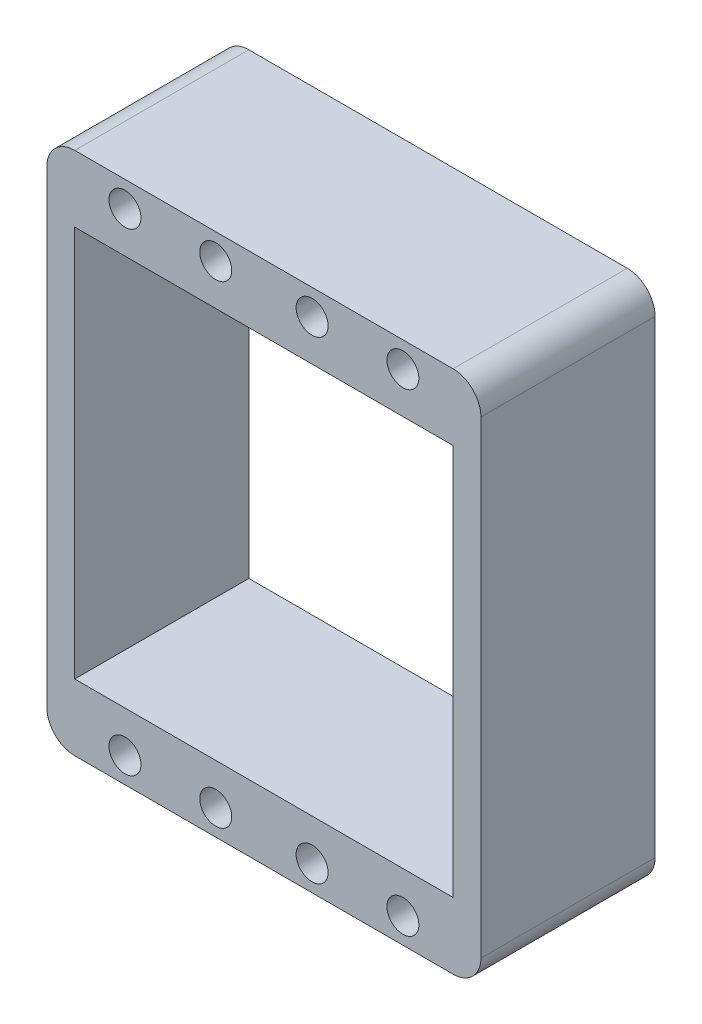
ISO-10303-21;
HEADER;
FILE_DESCRIPTION(('STEP AP214'),'2;1');
FILE_NAME('part.step','',(''),(''),'','','');
FILE_SCHEMA(('AUTOMOTIVE_DESIGN { 1 0 10303 214 1 1 1 1 }'));
ENDSEC;
DATA;
#1=APPLICATION_CONTEXT('core data for automotive mechanical design processes');
#2=APPLICATION_PROTOCOL_DEFINITION('international standard','automotive_design',2000,#1);
#3=PRODUCT_CONTEXT('',#1,'mechanical');
#4=PRODUCT('Part','Part','',(#3));
#5=PRODUCT_RELATED_PRODUCT_CATEGORY('part','',(#4));
#6=PRODUCT_DEFINITION_FORMATION('','',#4);
#7=PRODUCT_DEFINITION_CONTEXT('part definition',#1,'design');
#8=PRODUCT_DEFINITION('design','',#6,#7);
#9=PRODUCT_DEFINITION_SHAPE('','',#8);
#10=(LENGTH_UNIT() NAMED_UNIT(*) SI_UNIT(.MILLI.,.METRE.));
#11=(NAMED_UNIT(*) PLANE_ANGLE_UNIT() SI_UNIT($,.RADIAN.));
#12=(NAMED_UNIT(*) SI_UNIT($,.STERADIAN.) SOLID_ANGLE_UNIT());
#13=UNCERTAINTY_MEASURE_WITH_UNIT(LENGTH_MEASURE(1.E-05),#10,'distance_accuracy_value','');
#14=(GEOMETRIC_REPRESENTATION_CONTEXT(3) GLOBAL_UNCERTAINTY_ASSIGNED_CONTEXT((#13)) GLOBAL_UNIT_ASSIGNED_CONTEXT((#10,
#11,#12)) REPRESENTATION_CONTEXT('',''));
#15=CARTESIAN_POINT('',(0.,0.,0.));
#16=DIRECTION('',(0.,0.,1.));
#17=DIRECTION('',(1.,0.,0.));
#18=AXIS2_PLACEMENT_3D('',#15,#16,#17);
#19=CARTESIAN_POINT('',(0.,0.,18.8));
#20=DIRECTION('',(0.,0.,-1.));
#21=DIRECTION('',(-1.,0.,0.));
#22=AXIS2_PLACEMENT_3D('',#19,#20,#21);
#23=PLANE('',#22);
#24=CARTESIAN_POINT('',(-5.2,25.55,18.8));
#25=DIRECTION('',(0.,0.,1.));
#26=DIRECTION('',(-1.,0.,0.));
#27=AXIS2_PLACEMENT_3D('',#24,#25,#26);
#28=CIRCLE('',#27,1.725);
#29=CARTESIAN_POINT('',(-6.92500000000001,25.55,18.8));
#30=VERTEX_POINT('',#29);
#31=EDGE_CURVE('E463',#30,#30,#28,.T.);
#32=ORIENTED_EDGE('',*,*,#31,.F.);
#33=EDGE_LOOP('',(#32));
#34=FACE_BOUND('',#33,.T.);
#35=CARTESIAN_POINT('',(15.,25.55,18.8));
#36=DIRECTION('',(0.,0.,1.));
#37=DIRECTION('',(-1.,0.,0.));
#38=AXIS2_PLACEMENT_3D('',#35,#36,#37);
#39=CIRCLE('',#38,1.725);
#40=CARTESIAN_POINT('',(13.275,25.55,18.8));
#41=VERTEX_POINT('',#40);
#42=EDGE_CURVE('E475',#41,#41,#39,.T.);
#43=ORIENTED_EDGE('',*,*,#42,.F.);
#44=EDGE_LOOP('',(#43));
#45=FACE_BOUND('',#44,.T.);
#46=CARTESIAN_POINT('',(5.19999999999999,-25.55,18.8));
#47=DIRECTION('',(0.,0.,1.));
#48=DIRECTION('',(1.,0.,0.));
#49=AXIS2_PLACEMENT_3D('',#46,#47,#48);
#50=CIRCLE('',#49,1.725);
#51=CARTESIAN_POINT('',(6.92499999999999,-25.55,18.8));
#52=VERTEX_POINT('',#51);
#53=EDGE_CURVE('E487',#52,#52,#50,.T.);
#54=ORIENTED_EDGE('',*,*,#53,.F.);
#55=EDGE_LOOP('',(#54));
#56=FACE_BOUND('',#55,.T.);
#57=CARTESIAN_POINT('',(-15.,-25.55,18.8));
#58=DIRECTION('',(0.,0.,1.));
#59=DIRECTION('',(1.,0.,0.));
#60=AXIS2_PLACEMENT_3D('',#57,#58,#59);
#61=CIRCLE('',#60,1.725);
#62=CARTESIAN_POINT('',(-13.275,-25.55,18.8));
#63=VERTEX_POINT('',#62);
#64=EDGE_CURVE('E159',#63,#63,#61,.T.);
#65=ORIENTED_EDGE('',*,*,#64,.F.);
#66=EDGE_LOOP('',(#65));
#67=FACE_BOUND('',#66,.T.);
#68=DIRECTION('',(0.,-1.,0.));
#69=VECTOR('',#68,1.);
#70=CARTESIAN_POINT('',(-23.425,-28.3,18.8));
#71=LINE('',#70,#69);
#72=CARTESIAN_POINT('',(-23.425,25.3,18.8));
#73=VERTEX_POINT('',#72);
#74=CARTESIAN_POINT('',(-23.425,-25.3,18.8));
#75=VERTEX_POINT('',#74);
#76=EDGE_CURVE('E170',#73,#75,#71,.T.);
#77=ORIENTED_EDGE('',*,*,#76,.T.);
#78=CARTESIAN_POINT('',(-20.425,-25.3,18.8));
#79=DIRECTION('',(0.,0.,-1.));
#80=DIRECTION('',(-1.,0.,0.));
#81=AXIS2_PLACEMENT_3D('',#78,#79,#80);
#82=CIRCLE('',#81,3.);
#83=CARTESIAN_POINT('',(-20.425,-28.3,18.8));
#84=VERTEX_POINT('',#83);
#85=EDGE_CURVE('E213',#75,#84,#82,.F.);
#86=ORIENTED_EDGE('',*,*,#85,.T.);
#87=DIRECTION('',(1.,0.,0.));
#88=VECTOR('',#87,1.);
#89=CARTESIAN_POINT('',(23.425,-28.3,18.8));
#90=LINE('',#89,#88);
#91=CARTESIAN_POINT('',(20.425,-28.3,18.8));
#92=VERTEX_POINT('',#91);
#93=EDGE_CURVE('E173',#84,#92,#90,.T.);
#94=ORIENTED_EDGE('',*,*,#93,.T.);
#95=CARTESIAN_POINT('',(20.425,-25.3,18.8));
#96=DIRECTION('',(0.,0.,-1.));
#97=DIRECTION('',(-1.,0.,0.));
#98=AXIS2_PLACEMENT_3D('',#95,#96,#97);
#99=CIRCLE('',#98,3.);
#100=CARTESIAN_POINT('',(23.425,-25.3,18.8));
#101=VERTEX_POINT('',#100);
#102=EDGE_CURVE('E211',#92,#101,#99,.F.);
#103=ORIENTED_EDGE('',*,*,#102,.T.);
#104=DIRECTION('',(0.,1.,0.));
#105=VECTOR('',#104,1.);
#106=CARTESIAN_POINT('',(23.425,28.3,18.8));
#107=LINE('',#106,#105);
#108=CARTESIAN_POINT('',(23.425,25.3,18.8));
#109=VERTEX_POINT('',#108);
#110=EDGE_CURVE('E177',#101,#109,#107,.T.);
#111=ORIENTED_EDGE('',*,*,#110,.T.);
#112=CARTESIAN_POINT('',(20.425,25.3,18.8));
#113=DIRECTION('',(0.,0.,-1.));
#114=DIRECTION('',(-1.,0.,0.));
#115=AXIS2_PLACEMENT_3D('',#112,#113,#114);
#116=CIRCLE('',#115,3.);
#117=CARTESIAN_POINT('',(20.425,28.3,18.8));
#118=VERTEX_POINT('',#117);
#119=EDGE_CURVE('E56',#109,#118,#116,.F.);
#120=ORIENTED_EDGE('',*,*,#119,.T.);
#121=DIRECTION('',(-1.,0.,0.));
#122=VECTOR('',#121,1.);
#123=CARTESIAN_POINT('',(-23.425,28.3,18.8));
#124=LINE('',#123,#122);
#125=CARTESIAN_POINT('',(-20.425,28.3,18.8));
#126=VERTEX_POINT('',#125);
#127=EDGE_CURVE('E179',#118,#126,#124,.T.);
#128=ORIENTED_EDGE('',*,*,#127,.T.);
#129=CARTESIAN_POINT('',(-20.425,25.3,18.8));
#130=DIRECTION('',(0.,0.,-1.));
#131=DIRECTION('',(-1.,0.,0.));
#132=AXIS2_PLACEMENT_3D('',#129,#130,#131);
#133=CIRCLE('',#132,3.);
#134=EDGE_CURVE('E208',#126,#73,#133,.F.);
#135=ORIENTED_EDGE('',*,*,#134,.T.);
#136=EDGE_LOOP('',(#77,#86,#94,#103,#111,#120,#128,#135));
#137=FACE_BOUND('',#136,.T.);
#138=DIRECTION('',(0.,1.,0.));
#139=VECTOR('',#138,1.);
#140=CARTESIAN_POINT('',(20.425,-21.125,18.8));
#141=LINE('',#140,#139);
#142=CARTESIAN_POINT('',(20.425,-21.125,18.8));
#143=VERTEX_POINT('',#142);
#144=CARTESIAN_POINT('',(20.425,21.125,18.8));
#145=VERTEX_POINT('',#144);
#146=EDGE_CURVE('E126',#143,#145,#141,.T.);
#147=ORIENTED_EDGE('',*,*,#146,.F.);
#148=DIRECTION('',(1.,0.,0.));
#149=VECTOR('',#148,1.);
#150=CARTESIAN_POINT('',(-20.425,-21.125,18.8));
#151=LINE('',#150,#149);
#152=CARTESIAN_POINT('',(-20.425,-21.125,18.8));
#153=VERTEX_POINT('',#152);
#154=EDGE_CURVE('E152',#153,#143,#151,.T.);
#155=ORIENTED_EDGE('',*,*,#154,.F.);
#156=DIRECTION('',(0.,-1.,0.));
#157=VECTOR('',#156,1.);
#158=CARTESIAN_POINT('',(-20.425,-21.125,18.8));
#159=LINE('',#158,#157);
#160=CARTESIAN_POINT('',(-20.425,21.125,18.8));
#161=VERTEX_POINT('',#160);
#162=EDGE_CURVE('E150',#161,#153,#159,.T.);
#163=ORIENTED_EDGE('',*,*,#162,.F.);
#164=DIRECTION('',(-1.,0.,0.));
#165=VECTOR('',#164,1.);
#166=CARTESIAN_POINT('',(-20.425,21.125,18.8));
#167=LINE('',#166,#165);
#168=EDGE_CURVE('E136',#145,#161,#167,.T.);
#169=ORIENTED_EDGE('',*,*,#168,.F.);
#170=EDGE_LOOP('',(#147,#155,#163,#169));
#171=FACE_BOUND('',#170,.T.);
#172=CARTESIAN_POINT('',(-5.2,-25.55,18.8));
#173=DIRECTION('',(0.,0.,1.));
#174=DIRECTION('',(1.,0.,0.));
#175=AXIS2_PLACEMENT_3D('',#172,#173,#174);
#176=CIRCLE('',#175,1.725);
#177=CARTESIAN_POINT('',(-3.475,-25.55,18.8));
#178=VERTEX_POINT('',#177);
#179=EDGE_CURVE('E493',#178,#178,#176,.T.);
#180=ORIENTED_EDGE('',*,*,#179,.F.);
#181=EDGE_LOOP('',(#180));
#182=FACE_BOUND('',#181,.T.);
#183=CARTESIAN_POINT('',(15.,-25.55,18.8));
#184=DIRECTION('',(0.,0.,1.));
#185=DIRECTION('',(1.,0.,0.));
#186=AXIS2_PLACEMENT_3D('',#183,#184,#185);
#187=CIRCLE('',#186,1.725);
#188=CARTESIAN_POINT('',(16.725,-25.55,18.8));
#189=VERTEX_POINT('',#188);
#190=EDGE_CURVE('E481',#189,#189,#187,.T.);
#191=ORIENTED_EDGE('',*,*,#190,.F.);
#192=EDGE_LOOP('',(#191));
#193=FACE_BOUND('',#192,.T.);
#194=CARTESIAN_POINT('',(5.19999999999999,25.55,18.8));
#195=DIRECTION('',(0.,0.,1.));
#196=DIRECTION('',(-1.,0.,0.));
#197=AXIS2_PLACEMENT_3D('',#194,#195,#196);
#198=CIRCLE('',#197,1.725);
#199=CARTESIAN_POINT('',(3.47499999999999,25.55,18.8));
#200=VERTEX_POINT('',#199);
#201=EDGE_CURVE('E469',#200,#200,#198,.T.);
#202=ORIENTED_EDGE('',*,*,#201,.F.);
#203=EDGE_LOOP('',(#202));
#204=FACE_BOUND('',#203,.T.);
#205=CARTESIAN_POINT('',(-15.,25.55,18.8));
#206=DIRECTION('',(0.,0.,1.));
#207=DIRECTION('',(-1.,0.,0.));
#208=AXIS2_PLACEMENT_3D('',#205,#206,#207);
#209=CIRCLE('',#208,1.725);
#210=CARTESIAN_POINT('',(-16.725,25.55,18.8));
#211=VERTEX_POINT('',#210);
#212=EDGE_CURVE('E454',#211,#211,#209,.T.);
#213=ORIENTED_EDGE('',*,*,#212,.F.);
#214=EDGE_LOOP('',(#213));
#215=FACE_BOUND('',#214,.T.);
#216=ADVANCED_FACE('F35',(#34,#45,#56,#67,#137,#171,#182,#193,#204,#215),#23,.F.);
#217=CARTESIAN_POINT('',(0.,0.,0.));
#218=DIRECTION('',(0.,0.,-1.));
#219=DIRECTION('',(-1.,0.,0.));
#220=AXIS2_PLACEMENT_3D('',#217,#218,#219);
#221=PLANE('',#220);
#222=CARTESIAN_POINT('',(-5.2,25.55,0.));
#223=DIRECTION('',(0.,0.,1.));
#224=DIRECTION('',(-1.,0.,0.));
#225=AXIS2_PLACEMENT_3D('',#222,#223,#224);
#226=CIRCLE('',#225,1.725);
#227=CARTESIAN_POINT('',(-6.92500000000001,25.55,0.));
#228=VERTEX_POINT('',#227);
#229=EDGE_CURVE('E460',#228,#228,#226,.T.);
#230=ORIENTED_EDGE('',*,*,#229,.T.);
#231=EDGE_LOOP('',(#230));
#232=FACE_BOUND('',#231,.T.);
#233=CARTESIAN_POINT('',(15.,25.55,0.));
#234=DIRECTION('',(0.,0.,1.));
#235=DIRECTION('',(-1.,0.,0.));
#236=AXIS2_PLACEMENT_3D('',#233,#234,#235);
#237=CIRCLE('',#236,1.725);
#238=CARTESIAN_POINT('',(13.275,25.55,0.));
#239=VERTEX_POINT('',#238);
#240=EDGE_CURVE('E472',#239,#239,#237,.T.);
#241=ORIENTED_EDGE('',*,*,#240,.T.);
#242=EDGE_LOOP('',(#241));
#243=FACE_BOUND('',#242,.T.);
#244=CARTESIAN_POINT('',(5.19999999999999,-25.55,0.));
#245=DIRECTION('',(0.,0.,1.));
#246=DIRECTION('',(1.,0.,0.));
#247=AXIS2_PLACEMENT_3D('',#244,#245,#246);
#248=CIRCLE('',#247,1.725);
#249=CARTESIAN_POINT('',(6.92499999999999,-25.55,0.));
#250=VERTEX_POINT('',#249);
#251=EDGE_CURVE('E484',#250,#250,#248,.T.);
#252=ORIENTED_EDGE('',*,*,#251,.T.);
#253=EDGE_LOOP('',(#252));
#254=FACE_BOUND('',#253,.T.);
#255=CARTESIAN_POINT('',(-15.,-25.55,0.));
#256=DIRECTION('',(0.,0.,1.));
#257=DIRECTION('',(1.,0.,0.));
#258=AXIS2_PLACEMENT_3D('',#255,#256,#257);
#259=CIRCLE('',#258,1.725);
#260=CARTESIAN_POINT('',(-13.275,-25.55,0.));
#261=VERTEX_POINT('',#260);
#262=EDGE_CURVE('E496',#261,#261,#259,.T.);
#263=ORIENTED_EDGE('',*,*,#262,.T.);
#264=EDGE_LOOP('',(#263));
#265=FACE_BOUND('',#264,.T.);
#266=DIRECTION('',(1.,0.,0.));
#267=VECTOR('',#266,1.);
#268=CARTESIAN_POINT('',(23.425,-28.3,0.));
#269=LINE('',#268,#267);
#270=CARTESIAN_POINT('',(-20.425,-28.3,0.));
#271=VERTEX_POINT('',#270);
#272=CARTESIAN_POINT('',(20.425,-28.3,0.));
#273=VERTEX_POINT('',#272);
#274=EDGE_CURVE('E184',#271,#273,#269,.T.);
#275=ORIENTED_EDGE('',*,*,#274,.F.);
#276=CARTESIAN_POINT('',(-20.425,-25.3,0.));
#277=DIRECTION('',(0.,0.,-1.));
#278=DIRECTION('',(-1.,0.,0.));
#279=AXIS2_PLACEMENT_3D('',#276,#277,#278);
#280=CIRCLE('',#279,3.);
#281=CARTESIAN_POINT('',(-23.425,-25.3,0.));
#282=VERTEX_POINT('',#281);
#283=EDGE_CURVE('E201',#271,#282,#280,.T.);
#284=ORIENTED_EDGE('',*,*,#283,.T.);
#285=DIRECTION('',(0.,-1.,0.));
#286=VECTOR('',#285,1.);
#287=CARTESIAN_POINT('',(-23.425,-28.3,0.));
#288=LINE('',#287,#286);
#289=CARTESIAN_POINT('',(-23.425,25.3,0.));
#290=VERTEX_POINT('',#289);
#291=EDGE_CURVE('E144',#290,#282,#288,.T.);
#292=ORIENTED_EDGE('',*,*,#291,.F.);
#293=CARTESIAN_POINT('',(-20.425,25.3,0.));
#294=DIRECTION('',(0.,0.,-1.));
#295=DIRECTION('',(-1.,0.,0.));
#296=AXIS2_PLACEMENT_3D('',#293,#294,#295);
#297=CIRCLE('',#296,3.);
#298=CARTESIAN_POINT('',(-20.425,28.3,0.));
#299=VERTEX_POINT('',#298);
#300=EDGE_CURVE('E195',#290,#299,#297,.T.);
#301=ORIENTED_EDGE('',*,*,#300,.T.);
#302=DIRECTION('',(-1.,0.,0.));
#303=VECTOR('',#302,1.);
#304=CARTESIAN_POINT('',(-23.425,28.3,0.));
#305=LINE('',#304,#303);
#306=CARTESIAN_POINT('',(20.425,28.3,0.));
#307=VERTEX_POINT('',#306);
#308=EDGE_CURVE('E174',#307,#299,#305,.T.);
#309=ORIENTED_EDGE('',*,*,#308,.F.);
#310=CARTESIAN_POINT('',(20.425,25.3,0.));
#311=DIRECTION('',(0.,0.,-1.));
#312=DIRECTION('',(-1.,0.,0.));
#313=AXIS2_PLACEMENT_3D('',#310,#311,#312);
#314=CIRCLE('',#313,3.);
#315=CARTESIAN_POINT('',(23.425,25.3,0.));
#316=VERTEX_POINT('',#315);
#317=EDGE_CURVE('E197',#307,#316,#314,.T.);
#318=ORIENTED_EDGE('',*,*,#317,.T.);
#319=DIRECTION('',(0.,1.,0.));
#320=VECTOR('',#319,1.);
#321=CARTESIAN_POINT('',(23.425,28.3,0.));
#322=LINE('',#321,#320);
#323=CARTESIAN_POINT('',(23.425,-25.3,0.));
#324=VERTEX_POINT('',#323);
#325=EDGE_CURVE('E187',#324,#316,#322,.T.);
#326=ORIENTED_EDGE('',*,*,#325,.F.);
#327=CARTESIAN_POINT('',(20.425,-25.3,0.));
#328=DIRECTION('',(0.,0.,-1.));
#329=DIRECTION('',(-1.,0.,0.));
#330=AXIS2_PLACEMENT_3D('',#327,#328,#329);
#331=CIRCLE('',#330,3.);
#332=EDGE_CURVE('E199',#324,#273,#331,.T.);
#333=ORIENTED_EDGE('',*,*,#332,.T.);
#334=EDGE_LOOP('',(#275,#284,#292,#301,#309,#318,#326,#333));
#335=FACE_BOUND('',#334,.T.);
#336=DIRECTION('',(1.,0.,0.));
#337=VECTOR('',#336,1.);
#338=CARTESIAN_POINT('',(-20.425,-21.125,0.));
#339=LINE('',#338,#337);
#340=CARTESIAN_POINT('',(-20.425,-21.125,0.));
#341=VERTEX_POINT('',#340);
#342=CARTESIAN_POINT('',(20.425,-21.125,0.));
#343=VERTEX_POINT('',#342);
#344=EDGE_CURVE('E137',#341,#343,#339,.T.);
#345=ORIENTED_EDGE('',*,*,#344,.T.);
#346=DIRECTION('',(0.,1.,0.));
#347=VECTOR('',#346,1.);
#348=CARTESIAN_POINT('',(20.425,-21.125,0.));
#349=LINE('',#348,#347);
#350=CARTESIAN_POINT('',(20.425,21.125,0.));
#351=VERTEX_POINT('',#350);
#352=EDGE_CURVE('E157',#343,#351,#349,.T.);
#353=ORIENTED_EDGE('',*,*,#352,.T.);
#354=DIRECTION('',(-1.,0.,0.));
#355=VECTOR('',#354,1.);
#356=CARTESIAN_POINT('',(-20.425,21.125,0.));
#357=LINE('',#356,#355);
#358=CARTESIAN_POINT('',(-20.425,21.125,0.));
#359=VERTEX_POINT('',#358);
#360=EDGE_CURVE('E143',#351,#359,#357,.T.);
#361=ORIENTED_EDGE('',*,*,#360,.T.);
#362=DIRECTION('',(0.,-1.,0.));
#363=VECTOR('',#362,1.);
#364=CARTESIAN_POINT('',(-20.425,-21.125,0.));
#365=LINE('',#364,#363);
#366=EDGE_CURVE('E161',#359,#341,#365,.T.);
#367=ORIENTED_EDGE('',*,*,#366,.T.);
#368=EDGE_LOOP('',(#345,#353,#361,#367));
#369=FACE_BOUND('',#368,.T.);
#370=CARTESIAN_POINT('',(-5.2,-25.55,0.));
#371=DIRECTION('',(0.,0.,1.));
#372=DIRECTION('',(1.,0.,0.));
#373=AXIS2_PLACEMENT_3D('',#370,#371,#372);
#374=CIRCLE('',#373,1.725);
#375=CARTESIAN_POINT('',(-3.475,-25.55,0.));
#376=VERTEX_POINT('',#375);
#377=EDGE_CURVE('E490',#376,#376,#374,.T.);
#378=ORIENTED_EDGE('',*,*,#377,.T.);
#379=EDGE_LOOP('',(#378));
#380=FACE_BOUND('',#379,.T.);
#381=CARTESIAN_POINT('',(15.,-25.55,0.));
#382=DIRECTION('',(0.,0.,1.));
#383=DIRECTION('',(1.,0.,0.));
#384=AXIS2_PLACEMENT_3D('',#381,#382,#383);
#385=CIRCLE('',#384,1.725);
#386=CARTESIAN_POINT('',(16.725,-25.55,0.));
#387=VERTEX_POINT('',#386);
#388=EDGE_CURVE('E478',#387,#387,#385,.T.);
#389=ORIENTED_EDGE('',*,*,#388,.T.);
#390=EDGE_LOOP('',(#389));
#391=FACE_BOUND('',#390,.T.);
#392=CARTESIAN_POINT('',(5.19999999999999,25.55,0.));
#393=DIRECTION('',(0.,0.,1.));
#394=DIRECTION('',(-1.,0.,0.));
#395=AXIS2_PLACEMENT_3D('',#392,#393,#394);
#396=CIRCLE('',#395,1.725);
#397=CARTESIAN_POINT('',(3.47499999999999,25.55,0.));
#398=VERTEX_POINT('',#397);
#399=EDGE_CURVE('E466',#398,#398,#396,.T.);
#400=ORIENTED_EDGE('',*,*,#399,.T.);
#401=EDGE_LOOP('',(#400));
#402=FACE_BOUND('',#401,.T.);
#403=CARTESIAN_POINT('',(-15.,25.55,0.));
#404=DIRECTION('',(0.,0.,1.));
#405=DIRECTION('',(-1.,0.,0.));
#406=AXIS2_PLACEMENT_3D('',#403,#404,#405);
#407=CIRCLE('',#406,1.725);
#408=CARTESIAN_POINT('',(-16.725,25.55,0.));
#409=VERTEX_POINT('',#408);
#410=EDGE_CURVE('E457',#409,#409,#407,.T.);
#411=ORIENTED_EDGE('',*,*,#410,.T.);
#412=EDGE_LOOP('',(#411));
#413=FACE_BOUND('',#412,.T.);
#414=ADVANCED_FACE('F229',(#232,#243,#254,#265,#335,#369,#380,#391,#402,#413),#221,.T.);
#415=CARTESIAN_POINT('',(-23.425,-28.3,18.8));
#416=DIRECTION('',(1.,0.,0.));
#417=DIRECTION('',(0.,0.,-1.));
#418=AXIS2_PLACEMENT_3D('',#415,#416,#417);
#419=PLANE('',#418);
#420=ORIENTED_EDGE('',*,*,#291,.T.);
#421=DIRECTION('',(0.,0.,-1.));
#422=VECTOR('',#421,1.);
#423=CARTESIAN_POINT('',(-23.425,-25.3,18.8));
#424=LINE('',#423,#422);
#425=EDGE_CURVE('E206',#282,#75,#424,.F.);
#426=ORIENTED_EDGE('',*,*,#425,.T.);
#427=ORIENTED_EDGE('',*,*,#76,.F.);
#428=DIRECTION('',(0.,0.,-1.));
#429=VECTOR('',#428,1.);
#430=CARTESIAN_POINT('',(-23.425,25.3,18.8));
#431=LINE('',#430,#429);
#432=EDGE_CURVE('E203',#73,#290,#431,.T.);
#433=ORIENTED_EDGE('',*,*,#432,.T.);
#434=EDGE_LOOP('',(#420,#426,#427,#433));
#435=FACE_BOUND('',#434,.T.);
#436=ADVANCED_FACE('F242',(#435),#419,.F.);
#437=CARTESIAN_POINT('',(23.425,-28.3,18.8));
#438=DIRECTION('',(0.,1.,0.));
#439=DIRECTION('',(0.,0.,1.));
#440=AXIS2_PLACEMENT_3D('',#437,#438,#439);
#441=PLANE('',#440);
#442=ORIENTED_EDGE('',*,*,#93,.F.);
#443=DIRECTION('',(0.,0.,-1.));
#444=VECTOR('',#443,1.);
#445=CARTESIAN_POINT('',(-20.425,-28.3,18.8));
#446=LINE('',#445,#444);
#447=EDGE_CURVE('E192',#84,#271,#446,.T.);
#448=ORIENTED_EDGE('',*,*,#447,.T.);
#449=ORIENTED_EDGE('',*,*,#274,.T.);
#450=DIRECTION('',(0.,0.,-1.));
#451=VECTOR('',#450,1.);
#452=CARTESIAN_POINT('',(20.425,-28.3,18.8));
#453=LINE('',#452,#451);
#454=EDGE_CURVE('E181',#273,#92,#453,.F.);
#455=ORIENTED_EDGE('',*,*,#454,.T.);
#456=EDGE_LOOP('',(#442,#448,#449,#455));
#457=FACE_BOUND('',#456,.T.);
#458=ADVANCED_FACE('F250',(#457),#441,.F.);
#459=CARTESIAN_POINT('',(23.425,28.3,18.8));
#460=DIRECTION('',(-1.,0.,0.));
#461=DIRECTION('',(0.,0.,1.));
#462=AXIS2_PLACEMENT_3D('',#459,#460,#461);
#463=PLANE('',#462);
#464=ORIENTED_EDGE('',*,*,#110,.F.);
#465=DIRECTION('',(0.,0.,-1.));
#466=VECTOR('',#465,1.);
#467=CARTESIAN_POINT('',(23.425,-25.3,18.8));
#468=LINE('',#467,#466);
#469=EDGE_CURVE('E217',#101,#324,#468,.T.);
#470=ORIENTED_EDGE('',*,*,#469,.T.);
#471=ORIENTED_EDGE('',*,*,#325,.T.);
#472=DIRECTION('',(0.,0.,-1.));
#473=VECTOR('',#472,1.);
#474=CARTESIAN_POINT('',(23.425,25.3,18.8));
#475=LINE('',#474,#473);
#476=EDGE_CURVE('E215',#316,#109,#475,.F.);
#477=ORIENTED_EDGE('',*,*,#476,.T.);
#478=EDGE_LOOP('',(#464,#470,#471,#477));
#479=FACE_BOUND('',#478,.T.);
#480=ADVANCED_FACE('F223',(#479),#463,.F.);
#481=CARTESIAN_POINT('',(-23.425,28.3,18.8));
#482=DIRECTION('',(0.,-1.,0.));
#483=DIRECTION('',(0.,0.,-1.));
#484=AXIS2_PLACEMENT_3D('',#481,#482,#483);
#485=PLANE('',#484);
#486=ORIENTED_EDGE('',*,*,#127,.F.);
#487=DIRECTION('',(0.,0.,-1.));
#488=VECTOR('',#487,1.);
#489=CARTESIAN_POINT('',(20.425,28.3,18.8));
#490=LINE('',#489,#488);
#491=EDGE_CURVE('E11',#118,#307,#490,.T.);
#492=ORIENTED_EDGE('',*,*,#491,.T.);
#493=ORIENTED_EDGE('',*,*,#308,.T.);
#494=DIRECTION('',(0.,0.,-1.));
#495=VECTOR('',#494,1.);
#496=CARTESIAN_POINT('',(-20.425,28.3,18.8));
#497=LINE('',#496,#495);
#498=EDGE_CURVE('E43',#299,#126,#497,.F.);
#499=ORIENTED_EDGE('',*,*,#498,.T.);
#500=EDGE_LOOP('',(#486,#492,#493,#499));
#501=FACE_BOUND('',#500,.T.);
#502=ADVANCED_FACE('F235',(#501),#485,.F.);
#503=CARTESIAN_POINT('',(20.425,-21.125,18.8));
#504=DIRECTION('',(-1.,0.,0.));
#505=DIRECTION('',(0.,0.,1.));
#506=AXIS2_PLACEMENT_3D('',#503,#504,#505);
#507=PLANE('',#506);
#508=ORIENTED_EDGE('',*,*,#352,.F.);
#509=DIRECTION('',(0.,0.,-1.));
#510=VECTOR('',#509,1.);
#511=CARTESIAN_POINT('',(20.425,-21.125,18.8));
#512=LINE('',#511,#510);
#513=EDGE_CURVE('E132',#143,#343,#512,.T.);
#514=ORIENTED_EDGE('',*,*,#513,.F.);
#515=ORIENTED_EDGE('',*,*,#146,.T.);
#516=DIRECTION('',(0.,0.,-1.));
#517=VECTOR('',#516,1.);
#518=CARTESIAN_POINT('',(20.425,21.125,18.8));
#519=LINE('',#518,#517);
#520=EDGE_CURVE('E129',#145,#351,#519,.T.);
#521=ORIENTED_EDGE('',*,*,#520,.T.);
#522=EDGE_LOOP('',(#508,#514,#515,#521));
#523=FACE_BOUND('',#522,.T.);
#524=ADVANCED_FACE('F128',(#523),#507,.T.);
#525=CARTESIAN_POINT('',(-20.425,21.125,18.8));
#526=DIRECTION('',(0.,-1.,0.));
#527=DIRECTION('',(0.,0.,-1.));
#528=AXIS2_PLACEMENT_3D('',#525,#526,#527);
#529=PLANE('',#528);
#530=ORIENTED_EDGE('',*,*,#360,.F.);
#531=ORIENTED_EDGE('',*,*,#520,.F.);
#532=ORIENTED_EDGE('',*,*,#168,.T.);
#533=DIRECTION('',(0.,0.,-1.));
#534=VECTOR('',#533,1.);
#535=CARTESIAN_POINT('',(-20.425,21.125,18.8));
#536=LINE('',#535,#534);
#537=EDGE_CURVE('E145',#161,#359,#536,.T.);
#538=ORIENTED_EDGE('',*,*,#537,.T.);
#539=EDGE_LOOP('',(#530,#531,#532,#538));
#540=FACE_BOUND('',#539,.T.);
#541=ADVANCED_FACE('F140',(#540),#529,.T.);
#542=CARTESIAN_POINT('',(-20.425,-21.125,18.8));
#543=DIRECTION('',(1.,0.,0.));
#544=DIRECTION('',(0.,0.,-1.));
#545=AXIS2_PLACEMENT_3D('',#542,#543,#544);
#546=PLANE('',#545);
#547=ORIENTED_EDGE('',*,*,#366,.F.);
#548=ORIENTED_EDGE('',*,*,#537,.F.);
#549=ORIENTED_EDGE('',*,*,#162,.T.);
#550=DIRECTION('',(0.,0.,-1.));
#551=VECTOR('',#550,1.);
#552=CARTESIAN_POINT('',(-20.425,-21.125,18.8));
#553=LINE('',#552,#551);
#554=EDGE_CURVE('E167',#153,#341,#553,.T.);
#555=ORIENTED_EDGE('',*,*,#554,.T.);
#556=EDGE_LOOP('',(#547,#548,#549,#555));
#557=FACE_BOUND('',#556,.T.);
#558=ADVANCED_FACE('F309',(#557),#546,.T.);
#559=CARTESIAN_POINT('',(-20.425,-21.125,18.8));
#560=DIRECTION('',(0.,1.,0.));
#561=DIRECTION('',(0.,0.,1.));
#562=AXIS2_PLACEMENT_3D('',#559,#560,#561);
#563=PLANE('',#562);
#564=ORIENTED_EDGE('',*,*,#344,.F.);
#565=ORIENTED_EDGE('',*,*,#554,.F.);
#566=ORIENTED_EDGE('',*,*,#154,.T.);
#567=ORIENTED_EDGE('',*,*,#513,.T.);
#568=EDGE_LOOP('',(#564,#565,#566,#567));
#569=FACE_BOUND('',#568,.T.);
#570=ADVANCED_FACE('F315',(#569),#563,.T.);
#571=CARTESIAN_POINT('',(-15.,-25.55,18.8));
#572=DIRECTION('',(0.,0.,-1.));
#573=DIRECTION('',(-1.,0.,0.));
#574=AXIS2_PLACEMENT_3D('',#571,#572,#573);
#575=CYLINDRICAL_SURFACE('',#574,1.725);
#576=ORIENTED_EDGE('',*,*,#64,.T.);
#577=EDGE_LOOP('',(#576));
#578=FACE_BOUND('',#577,.T.);
#579=ORIENTED_EDGE('',*,*,#262,.F.);
#580=EDGE_LOOP('',(#579));
#581=FACE_BOUND('',#580,.T.);
#582=ADVANCED_FACE('F323',(#578,#581),#575,.F.);
#583=CARTESIAN_POINT('',(-5.2,-25.55,18.8));
#584=DIRECTION('',(0.,0.,-1.));
#585=DIRECTION('',(-1.,0.,0.));
#586=AXIS2_PLACEMENT_3D('',#583,#584,#585);
#587=CYLINDRICAL_SURFACE('',#586,1.725);
#588=ORIENTED_EDGE('',*,*,#179,.T.);
#589=EDGE_LOOP('',(#588));
#590=FACE_BOUND('',#589,.T.);
#591=ORIENTED_EDGE('',*,*,#377,.F.);
#592=EDGE_LOOP('',(#591));
#593=FACE_BOUND('',#592,.T.);
#594=ADVANCED_FACE('F331',(#590,#593),#587,.F.);
#595=CARTESIAN_POINT('',(5.19999999999999,-25.55,18.8));
#596=DIRECTION('',(0.,0.,-1.));
#597=DIRECTION('',(-1.,0.,0.));
#598=AXIS2_PLACEMENT_3D('',#595,#596,#597);
#599=CYLINDRICAL_SURFACE('',#598,1.725);
#600=ORIENTED_EDGE('',*,*,#53,.T.);
#601=EDGE_LOOP('',(#600));
#602=FACE_BOUND('',#601,.T.);
#603=ORIENTED_EDGE('',*,*,#251,.F.);
#604=EDGE_LOOP('',(#603));
#605=FACE_BOUND('',#604,.T.);
#606=ADVANCED_FACE('F339',(#602,#605),#599,.F.);
#607=CARTESIAN_POINT('',(15.,-25.55,18.8));
#608=DIRECTION('',(0.,0.,-1.));
#609=DIRECTION('',(-1.,0.,0.));
#610=AXIS2_PLACEMENT_3D('',#607,#608,#609);
#611=CYLINDRICAL_SURFACE('',#610,1.725);
#612=ORIENTED_EDGE('',*,*,#190,.T.);
#613=EDGE_LOOP('',(#612));
#614=FACE_BOUND('',#613,.T.);
#615=ORIENTED_EDGE('',*,*,#388,.F.);
#616=EDGE_LOOP('',(#615));
#617=FACE_BOUND('',#616,.T.);
#618=ADVANCED_FACE('F347',(#614,#617),#611,.F.);
#619=CARTESIAN_POINT('',(15.,25.55,18.8));
#620=DIRECTION('',(0.,0.,-1.));
#621=DIRECTION('',(-1.,0.,0.));
#622=AXIS2_PLACEMENT_3D('',#619,#620,#621);
#623=CYLINDRICAL_SURFACE('',#622,1.725);
#624=ORIENTED_EDGE('',*,*,#42,.T.);
#625=EDGE_LOOP('',(#624));
#626=FACE_BOUND('',#625,.T.);
#627=ORIENTED_EDGE('',*,*,#240,.F.);
#628=EDGE_LOOP('',(#627));
#629=FACE_BOUND('',#628,.T.);
#630=ADVANCED_FACE('F355',(#626,#629),#623,.F.);
#631=CARTESIAN_POINT('',(5.19999999999999,25.55,18.8));
#632=DIRECTION('',(0.,0.,-1.));
#633=DIRECTION('',(-1.,0.,0.));
#634=AXIS2_PLACEMENT_3D('',#631,#632,#633);
#635=CYLINDRICAL_SURFACE('',#634,1.725);
#636=ORIENTED_EDGE('',*,*,#201,.T.);
#637=EDGE_LOOP('',(#636));
#638=FACE_BOUND('',#637,.T.);
#639=ORIENTED_EDGE('',*,*,#399,.F.);
#640=EDGE_LOOP('',(#639));
#641=FACE_BOUND('',#640,.T.);
#642=ADVANCED_FACE('F363',(#638,#641),#635,.F.);
#643=CARTESIAN_POINT('',(-5.2,25.55,18.8));
#644=DIRECTION('',(0.,0.,-1.));
#645=DIRECTION('',(-1.,0.,0.));
#646=AXIS2_PLACEMENT_3D('',#643,#644,#645);
#647=CYLINDRICAL_SURFACE('',#646,1.725);
#648=ORIENTED_EDGE('',*,*,#31,.T.);
#649=EDGE_LOOP('',(#648));
#650=FACE_BOUND('',#649,.T.);
#651=ORIENTED_EDGE('',*,*,#229,.F.);
#652=EDGE_LOOP('',(#651));
#653=FACE_BOUND('',#652,.T.);
#654=ADVANCED_FACE('F371',(#650,#653),#647,.F.);
#655=CARTESIAN_POINT('',(-15.,25.55,18.8));
#656=DIRECTION('',(0.,0.,-1.));
#657=DIRECTION('',(-1.,0.,0.));
#658=AXIS2_PLACEMENT_3D('',#655,#656,#657);
#659=CYLINDRICAL_SURFACE('',#658,1.725);
#660=ORIENTED_EDGE('',*,*,#212,.T.);
#661=EDGE_LOOP('',(#660));
#662=FACE_BOUND('',#661,.T.);
#663=ORIENTED_EDGE('',*,*,#410,.F.);
#664=EDGE_LOOP('',(#663));
#665=FACE_BOUND('',#664,.T.);
#666=ADVANCED_FACE('F259',(#662,#665),#659,.F.);
#667=CARTESIAN_POINT('',(-20.425,-25.3,18.8));
#668=DIRECTION('',(0.,0.,-1.));
#669=DIRECTION('',(-1.,0.,0.));
#670=AXIS2_PLACEMENT_3D('',#667,#668,#669);
#671=CYLINDRICAL_SURFACE('',#670,3.);
#672=ORIENTED_EDGE('',*,*,#85,.F.);
#673=ORIENTED_EDGE('',*,*,#425,.F.);
#674=ORIENTED_EDGE('',*,*,#283,.F.);
#675=ORIENTED_EDGE('',*,*,#447,.F.);
#676=EDGE_LOOP('',(#672,#673,#674,#675));
#677=FACE_BOUND('',#676,.T.);
#678=ADVANCED_FACE('F247',(#677),#671,.T.);
#679=CARTESIAN_POINT('',(20.425,-25.3,18.8));
#680=DIRECTION('',(0.,0.,-1.));
#681=DIRECTION('',(-1.,0.,0.));
#682=AXIS2_PLACEMENT_3D('',#679,#680,#681);
#683=CYLINDRICAL_SURFACE('',#682,3.);
#684=ORIENTED_EDGE('',*,*,#102,.F.);
#685=ORIENTED_EDGE('',*,*,#454,.F.);
#686=ORIENTED_EDGE('',*,*,#332,.F.);
#687=ORIENTED_EDGE('',*,*,#469,.F.);
#688=EDGE_LOOP('',(#684,#685,#686,#687));
#689=FACE_BOUND('',#688,.T.);
#690=ADVANCED_FACE('F252',(#689),#683,.T.);
#691=CARTESIAN_POINT('',(20.425,25.3,18.8));
#692=DIRECTION('',(0.,0.,-1.));
#693=DIRECTION('',(-1.,0.,0.));
#694=AXIS2_PLACEMENT_3D('',#691,#692,#693);
#695=CYLINDRICAL_SURFACE('',#694,3.);
#696=ORIENTED_EDGE('',*,*,#119,.F.);
#697=ORIENTED_EDGE('',*,*,#476,.F.);
#698=ORIENTED_EDGE('',*,*,#317,.F.);
#699=ORIENTED_EDGE('',*,*,#491,.F.);
#700=EDGE_LOOP('',(#696,#697,#698,#699));
#701=FACE_BOUND('',#700,.T.);
#702=ADVANCED_FACE('F234',(#701),#695,.T.);
#703=CARTESIAN_POINT('',(-20.425,25.3,18.8));
#704=DIRECTION('',(0.,0.,-1.));
#705=DIRECTION('',(-1.,0.,0.));
#706=AXIS2_PLACEMENT_3D('',#703,#704,#705);
#707=CYLINDRICAL_SURFACE('',#706,3.);
#708=ORIENTED_EDGE('',*,*,#134,.F.);
#709=ORIENTED_EDGE('',*,*,#498,.F.);
#710=ORIENTED_EDGE('',*,*,#300,.F.);
#711=ORIENTED_EDGE('',*,*,#432,.F.);
#712=EDGE_LOOP('',(#708,#709,#710,#711));
#713=FACE_BOUND('',#712,.T.);
#714=ADVANCED_FACE('F37',(#713),#707,.T.);
#715=CLOSED_SHELL('',(#216,#414,#436,#458,#480,#502,#524,#541,#558,#570,#582,#594,#606,#618,
#630,#642,#654,#666,#678,#690,#702,#714));
#716=MANIFOLD_SOLID_BREP('B2',#715);
#717=ADVANCED_BREP_SHAPE_REPRESENTATION('',(#18,#716),#14);
#718=SHAPE_DEFINITION_REPRESENTATION(#9,#717);
ENDSEC;
END-ISO-10303-21;
